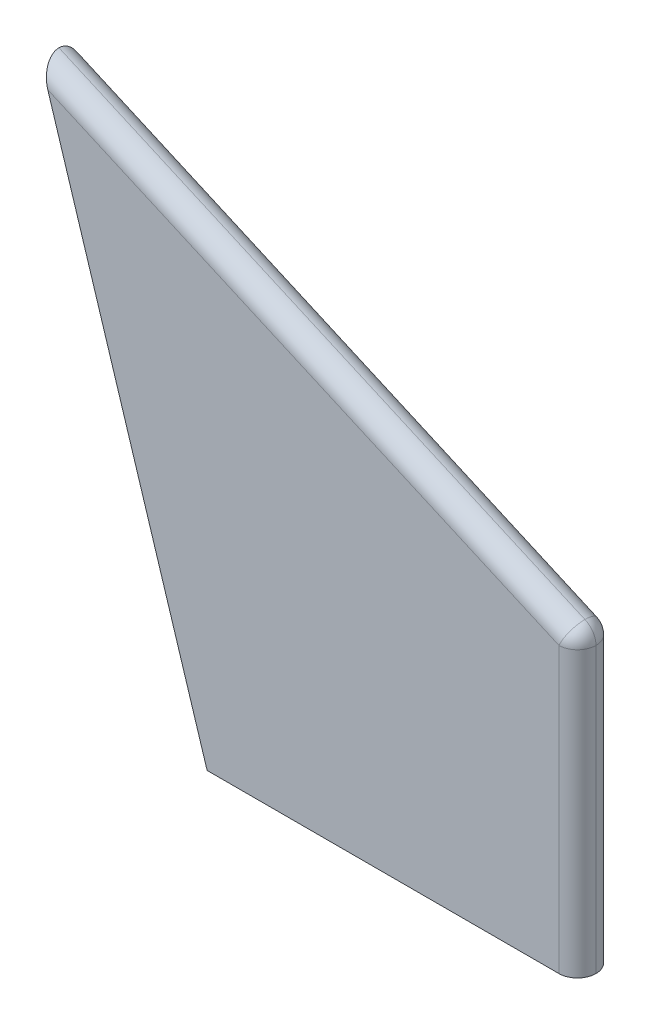
ISO-10303-21;
HEADER;
FILE_DESCRIPTION(('STEP AP214'),'2;1');
FILE_NAME('part.step','',(''),(''),'','','');
FILE_SCHEMA(('AUTOMOTIVE_DESIGN { 1 0 10303 214 1 1 1 1 }'));
ENDSEC;
DATA;
#1=APPLICATION_CONTEXT('core data for automotive mechanical design processes');
#2=APPLICATION_PROTOCOL_DEFINITION('international standard','automotive_design',2000,#1);
#3=PRODUCT_CONTEXT('',#1,'mechanical');
#4=PRODUCT('Part','Part','',(#3));
#5=PRODUCT_RELATED_PRODUCT_CATEGORY('part','',(#4));
#6=PRODUCT_DEFINITION_FORMATION('','',#4);
#7=PRODUCT_DEFINITION_CONTEXT('part definition',#1,'design');
#8=PRODUCT_DEFINITION('design','',#6,#7);
#9=PRODUCT_DEFINITION_SHAPE('','',#8);
#10=(LENGTH_UNIT() NAMED_UNIT(*) SI_UNIT(.MILLI.,.METRE.));
#11=(NAMED_UNIT(*) PLANE_ANGLE_UNIT() SI_UNIT($,.RADIAN.));
#12=(NAMED_UNIT(*) SI_UNIT($,.STERADIAN.) SOLID_ANGLE_UNIT());
#13=UNCERTAINTY_MEASURE_WITH_UNIT(LENGTH_MEASURE(1.E-05),#10,'distance_accuracy_value','');
#14=(GEOMETRIC_REPRESENTATION_CONTEXT(3) GLOBAL_UNCERTAINTY_ASSIGNED_CONTEXT((#13)) GLOBAL_UNIT_ASSIGNED_CONTEXT((#10,
#11,#12)) REPRESENTATION_CONTEXT('',''));
#15=CARTESIAN_POINT('',(0.,0.,0.));
#16=DIRECTION('',(0.,0.,1.));
#17=DIRECTION('',(1.,0.,0.));
#18=AXIS2_PLACEMENT_3D('',#15,#16,#17);
#19=CARTESIAN_POINT('',(178.472752746767,128.720260720498,2.5));
#20=DIRECTION('',(0.95447997803503,0.298274993135947,0.));
#21=DIRECTION('',(-0.298274993135947,0.95447997803503,0.));
#22=AXIS2_PLACEMENT_3D('',#19,#20,#21);
#23=PLANE('',#22);
#24=DIRECTION('',(0.,0.,-1.));
#25=VECTOR('',#24,1.);
#26=CARTESIAN_POINT('',(189.722752746767,92.7202607204978,2.5));
#27=LINE('',#26,#25);
#28=CARTESIAN_POINT('',(189.722752746767,92.7202607204978,0.0201626123751868));
#29=VERTEX_POINT('',#28);
#30=CARTESIAN_POINT('',(189.722752746767,92.7202607204978,0.));
#31=VERTEX_POINT('',#30);
#32=EDGE_CURVE('E222',#29,#31,#27,.T.);
#33=ORIENTED_EDGE('',*,*,#32,.F.);
#34=CARTESIAN_POINT('',(186.822752746767,102.000260720498,1.25));
#35=DIRECTION('',(0.95447997803503,0.298274993135947,0.));
#36=DIRECTION('',(0.298274993135947,-0.95447997803503,0.));
#37=AXIS2_PLACEMENT_3D('',#34,#35,#36);
#38=ELLIPSE('',#37,10.5607244069713,3.14999999999998);
#39=CARTESIAN_POINT('',(189.714119205727,92.7478880518253,0.));
#40=VERTEX_POINT('',#39);
#41=EDGE_CURVE('E231',#29,#40,#38,.T.);
#42=ORIENTED_EDGE('',*,*,#41,.T.);
#43=DIRECTION('',(0.298274993135947,-0.95447997803503,0.));
#44=VECTOR('',#43,1.);
#45=CARTESIAN_POINT('',(178.472752746767,128.720260720498,0.));
#46=LINE('',#45,#44);
#47=EDGE_CURVE('E176',#40,#31,#46,.T.);
#48=ORIENTED_EDGE('',*,*,#47,.T.);
#49=EDGE_LOOP('',(#33,#42,#48));
#50=FACE_BOUND('',#49,.T.);
#51=ADVANCED_FACE('F47',(#50),#23,.F.);
#52=DIRECTION('',(0.,0.,-1.));
#53=VECTOR('',#52,1.);
#54=CARTESIAN_POINT('',(189.691502746767,92.8202607204978,2.5));
#55=LINE('',#54,#53);
#56=CARTESIAN_POINT('',(189.691502746767,92.8202607204978,2.5));
#57=VERTEX_POINT('',#56);
#58=CARTESIAN_POINT('',(189.691502746767,92.8202607204978,0.));
#59=VERTEX_POINT('',#58);
#60=EDGE_CURVE('E63',#57,#59,#55,.T.);
#61=ORIENTED_EDGE('',*,*,#60,.F.);
#62=DIRECTION('',(0.298274993135947,-0.95447997803503,0.));
#63=VECTOR('',#62,1.);
#64=CARTESIAN_POINT('',(178.472752746767,128.720260720498,2.5));
#65=LINE('',#64,#63);
#66=CARTESIAN_POINT('',(178.968052924059,127.135300153165,2.5));
#67=VERTEX_POINT('',#66);
#68=EDGE_CURVE('E225',#67,#57,#65,.T.);
#69=ORIENTED_EDGE('',*,*,#68,.F.);
#70=CARTESIAN_POINT('',(178.968052924059,127.135300153165,1.25));
#71=DIRECTION('',(0.95447997803503,0.298274993135947,0.));
#72=DIRECTION('',(0.298274993135947,-0.95447997803503,0.));
#73=AXIS2_PLACEMENT_3D('',#70,#71,#72);
#74=ELLIPSE('',#73,1.66054878447608,1.25);
#75=CARTESIAN_POINT('',(178.472752746767,128.720260720498,1.25));
#76=VERTEX_POINT('',#75);
#77=EDGE_CURVE('E202',#67,#76,#74,.F.);
#78=ORIENTED_EDGE('',*,*,#77,.T.);
#79=CARTESIAN_POINT('',(178.968052924059,127.135300153165,1.25));
#80=DIRECTION('',(0.95447997803503,0.298274993135947,0.));
#81=DIRECTION('',(-0.298274993135947,0.95447997803503,0.));
#82=AXIS2_PLACEMENT_3D('',#79,#80,#81);
#83=ELLIPSE('',#82,1.66054878447608,1.25);
#84=CARTESIAN_POINT('',(178.968052924059,127.135300153165,0.));
#85=VERTEX_POINT('',#84);
#86=EDGE_CURVE('E214',#76,#85,#83,.F.);
#87=ORIENTED_EDGE('',*,*,#86,.T.);
#88=EDGE_CURVE('E144',#85,#59,#46,.T.);
#89=ORIENTED_EDGE('',*,*,#88,.T.);
#90=EDGE_LOOP('',(#61,#69,#78,#87,#89));
#91=FACE_BOUND('',#90,.T.);
#92=ADVANCED_FACE('F255',(#91),#23,.F.);
#93=CARTESIAN_POINT('',(189.714119205727,92.7478880518253,2.5));
#94=VERTEX_POINT('',#93);
#95=CARTESIAN_POINT('',(189.722752746767,92.7202607204978,2.5));
#96=VERTEX_POINT('',#95);
#97=EDGE_CURVE('E141',#94,#96,#65,.T.);
#98=ORIENTED_EDGE('',*,*,#97,.F.);
#99=CARTESIAN_POINT('',(189.722752746767,92.7202607204978,2.47983738762481));
#100=VERTEX_POINT('',#99);
#101=EDGE_CURVE('E98',#94,#100,#38,.T.);
#102=ORIENTED_EDGE('',*,*,#101,.T.);
#103=EDGE_CURVE('E203',#96,#100,#27,.T.);
#104=ORIENTED_EDGE('',*,*,#103,.F.);
#105=EDGE_LOOP('',(#98,#102,#104));
#106=FACE_BOUND('',#105,.T.);
#107=ADVANCED_FACE('F257',(#106),#23,.F.);
#108=CARTESIAN_POINT('',(189.722752746767,92.7202607204978,2.5));
#109=DIRECTION('',(0.,1.,0.));
#110=DIRECTION('',(-1.,0.,0.));
#111=AXIS2_PLACEMENT_3D('',#108,#109,#110);
#112=PLANE('',#111);
#113=ORIENTED_EDGE('',*,*,#103,.T.);
#114=CARTESIAN_POINT('',(186.822752746767,92.7202607204978,1.25));
#115=DIRECTION('',(0.,-1.,0.));
#116=DIRECTION('',(1.,0.,0.));
#117=AXIS2_PLACEMENT_3D('',#114,#115,#116);
#118=CIRCLE('',#117,3.14999999999998);
#119=EDGE_CURVE('E242',#29,#100,#118,.T.);
#120=ORIENTED_EDGE('',*,*,#119,.F.);
#121=ORIENTED_EDGE('',*,*,#32,.T.);
#122=DIRECTION('',(1.,0.,0.));
#123=VECTOR('',#122,1.);
#124=CARTESIAN_POINT('',(189.722752746767,92.7202607204978,0.));
#125=LINE('',#124,#123);
#126=CARTESIAN_POINT('',(213.472752746767,92.7202607204978,0.));
#127=VERTEX_POINT('',#126);
#128=EDGE_CURVE('E170',#31,#127,#125,.T.);
#129=ORIENTED_EDGE('',*,*,#128,.T.);
#130=CARTESIAN_POINT('',(213.472752746767,92.7202607204978,1.25));
#131=DIRECTION('',(0.,1.,0.));
#132=DIRECTION('',(-1.,0.,0.));
#133=AXIS2_PLACEMENT_3D('',#130,#131,#132);
#134=CIRCLE('',#133,1.25);
#135=CARTESIAN_POINT('',(214.722752746767,92.7202607204978,1.25));
#136=VERTEX_POINT('',#135);
#137=EDGE_CURVE('E132',#127,#136,#134,.F.);
#138=ORIENTED_EDGE('',*,*,#137,.T.);
#139=CARTESIAN_POINT('',(213.472752746767,92.7202607204978,1.25));
#140=DIRECTION('',(0.,1.,0.));
#141=DIRECTION('',(-1.,0.,0.));
#142=AXIS2_PLACEMENT_3D('',#139,#140,#141);
#143=CIRCLE('',#142,1.25);
#144=CARTESIAN_POINT('',(213.472752746767,92.7202607204978,2.5));
#145=VERTEX_POINT('',#144);
#146=EDGE_CURVE('E127',#136,#145,#143,.F.);
#147=ORIENTED_EDGE('',*,*,#146,.T.);
#148=DIRECTION('',(1.,0.,0.));
#149=VECTOR('',#148,1.);
#150=CARTESIAN_POINT('',(189.722752746767,92.7202607204978,2.5));
#151=LINE('',#150,#149);
#152=EDGE_CURVE('E130',#96,#145,#151,.T.);
#153=ORIENTED_EDGE('',*,*,#152,.F.);
#154=EDGE_LOOP('',(#113,#120,#121,#129,#138,#147,#153));
#155=FACE_BOUND('',#154,.T.);
#156=ADVANCED_FACE('F129',(#155),#112,.F.);
#157=CARTESIAN_POINT('',(0.,0.,2.5));
#158=DIRECTION('',(0.,0.,1.));
#159=DIRECTION('',(1.,0.,0.));
#160=AXIS2_PLACEMENT_3D('',#157,#158,#159);
#161=PLANE('',#160);
#162=DIRECTION('',(0.,-1.,0.));
#163=VECTOR('',#162,1.);
#164=CARTESIAN_POINT('',(189.714119205727,92.8202607204978,2.5));
#165=LINE('',#164,#163);
#166=CARTESIAN_POINT('',(189.714119205727,92.8202607204978,2.5));
#167=VERTEX_POINT('',#166);
#168=EDGE_CURVE('E228',#94,#167,#165,.F.);
#169=ORIENTED_EDGE('',*,*,#168,.F.);
#170=ORIENTED_EDGE('',*,*,#97,.T.);
#171=ORIENTED_EDGE('',*,*,#152,.T.);
#172=DIRECTION('',(0.,1.,0.));
#173=VECTOR('',#172,1.);
#174=CARTESIAN_POINT('',(213.472752746767,111.353915403832,2.5));
#175=LINE('',#174,#173);
#176=CARTESIAN_POINT('',(213.472752746767,111.905639541763,2.5));
#177=VERTEX_POINT('',#176);
#178=EDGE_CURVE('E72',#145,#177,#175,.T.);
#179=ORIENTED_EDGE('',*,*,#178,.T.);
#180=DIRECTION('',(0.914849258641217,-0.403795534848537,0.));
#181=VECTOR('',#180,1.);
#182=CARTESIAN_POINT('',(76.1462015922261,172.518737982388,2.5));
#183=LINE('',#182,#181);
#184=EDGE_CURVE('E180',#177,#67,#183,.F.);
#185=ORIENTED_EDGE('',*,*,#184,.T.);
#186=ORIENTED_EDGE('',*,*,#68,.T.);
#187=DIRECTION('',(1.,0.,0.));
#188=VECTOR('',#187,1.);
#189=CARTESIAN_POINT('',(0.,92.8202607204979,2.5));
#190=LINE('',#189,#188);
#191=EDGE_CURVE('E235',#57,#167,#190,.T.);
#192=ORIENTED_EDGE('',*,*,#191,.T.);
#193=EDGE_LOOP('',(#169,#170,#171,#179,#185,#186,#192));
#194=FACE_BOUND('',#193,.T.);
#195=ADVANCED_FACE('F139',(#194),#161,.T.);
#196=CARTESIAN_POINT('',(0.,0.,0.));
#197=DIRECTION('',(0.,0.,1.));
#198=DIRECTION('',(1.,0.,0.));
#199=AXIS2_PLACEMENT_3D('',#196,#197,#198);
#200=PLANE('',#199);
#201=ORIENTED_EDGE('',*,*,#47,.F.);
#202=DIRECTION('',(0.,-1.,0.));
#203=VECTOR('',#202,1.);
#204=CARTESIAN_POINT('',(189.714119205727,92.8202607204978,0.));
#205=LINE('',#204,#203);
#206=CARTESIAN_POINT('',(189.714119205727,92.8202607204978,0.));
#207=VERTEX_POINT('',#206);
#208=EDGE_CURVE('E11',#40,#207,#205,.F.);
#209=ORIENTED_EDGE('',*,*,#208,.T.);
#210=DIRECTION('',(1.,0.,0.));
#211=VECTOR('',#210,1.);
#212=CARTESIAN_POINT('',(0.,92.8202607204979,0.));
#213=LINE('',#212,#211);
#214=EDGE_CURVE('E56',#59,#207,#213,.T.);
#215=ORIENTED_EDGE('',*,*,#214,.F.);
#216=ORIENTED_EDGE('',*,*,#88,.F.);
#217=DIRECTION('',(0.914849258641217,-0.403795534848537,0.));
#218=VECTOR('',#217,1.);
#219=CARTESIAN_POINT('',(214.218008328207,111.576699147196,0.));
#220=LINE('',#219,#218);
#221=CARTESIAN_POINT('',(213.472752746767,111.905639541763,0.));
#222=VERTEX_POINT('',#221);
#223=EDGE_CURVE('E191',#85,#222,#220,.T.);
#224=ORIENTED_EDGE('',*,*,#223,.T.);
#225=DIRECTION('',(0.,1.,0.));
#226=VECTOR('',#225,1.);
#227=CARTESIAN_POINT('',(213.472752746767,0.,0.));
#228=LINE('',#227,#226);
#229=EDGE_CURVE('E137',#222,#127,#228,.F.);
#230=ORIENTED_EDGE('',*,*,#229,.T.);
#231=ORIENTED_EDGE('',*,*,#128,.F.);
#232=EDGE_LOOP('',(#201,#209,#215,#216,#224,#230,#231));
#233=FACE_BOUND('',#232,.T.);
#234=ADVANCED_FACE('F198',(#233),#200,.F.);
#235=CARTESIAN_POINT('',(177.968008328207,127.576699147196,1.25));
#236=DIRECTION('',(0.914849258641217,-0.403795534848537,0.));
#237=DIRECTION('',(0.403795534848537,0.914849258641217,0.));
#238=AXIS2_PLACEMENT_3D('',#235,#236,#237);
#239=CYLINDRICAL_SURFACE('',#238,1.25);
#240=ORIENTED_EDGE('',*,*,#184,.F.);
#241=CARTESIAN_POINT('',(213.472752746767,111.905639541763,1.25));
#242=DIRECTION('',(0.914849258641217,-0.403795534848537,0.));
#243=DIRECTION('',(0.403795534848537,0.914849258641217,0.));
#244=AXIS2_PLACEMENT_3D('',#241,#242,#243);
#245=CIRCLE('',#244,1.25);
#246=CARTESIAN_POINT('',(213.977497165328,113.049201115064,1.25));
#247=VERTEX_POINT('',#246);
#248=EDGE_CURVE('E148',#177,#247,#245,.F.);
#249=ORIENTED_EDGE('',*,*,#248,.T.);
#250=DIRECTION('',(0.914849258641217,-0.403795534848537,0.));
#251=VECTOR('',#250,1.);
#252=CARTESIAN_POINT('',(178.472752746767,128.720260720498,1.25));
#253=LINE('',#252,#251);
#254=EDGE_CURVE('E167',#76,#247,#253,.T.);
#255=ORIENTED_EDGE('',*,*,#254,.F.);
#256=ORIENTED_EDGE('',*,*,#77,.F.);
#257=EDGE_LOOP('',(#240,#249,#255,#256));
#258=FACE_BOUND('',#257,.T.);
#259=ADVANCED_FACE('F209',(#258),#239,.T.);
#260=CARTESIAN_POINT('',(76.1462015922261,172.518737982388,1.25));
#261=DIRECTION('',(-0.914849258641217,0.403795534848537,0.));
#262=DIRECTION('',(-0.403795534848537,-0.914849258641217,0.));
#263=AXIS2_PLACEMENT_3D('',#260,#261,#262);
#264=CYLINDRICAL_SURFACE('',#263,1.25);
#265=ORIENTED_EDGE('',*,*,#254,.T.);
#266=CARTESIAN_POINT('',(213.472752746767,111.905639541763,1.25));
#267=DIRECTION('',(-0.914849258641217,0.403795534848537,0.));
#268=DIRECTION('',(-0.403795534848537,-0.914849258641217,0.));
#269=AXIS2_PLACEMENT_3D('',#266,#267,#268);
#270=CIRCLE('',#269,1.25);
#271=EDGE_CURVE('E152',#247,#222,#270,.T.);
#272=ORIENTED_EDGE('',*,*,#271,.T.);
#273=ORIENTED_EDGE('',*,*,#223,.F.);
#274=ORIENTED_EDGE('',*,*,#86,.F.);
#275=EDGE_LOOP('',(#265,#272,#273,#274));
#276=FACE_BOUND('',#275,.T.);
#277=ADVANCED_FACE('F190',(#276),#264,.T.);
#278=CARTESIAN_POINT('',(213.472752746767,111.905639541763,1.25));
#279=DIRECTION('',(-1.,0.,0.));
#280=DIRECTION('',(0.,0.,1.));
#281=AXIS2_PLACEMENT_3D('',#278,#279,#280);
#282=SPHERICAL_SURFACE('',#281,1.25);
#283=CARTESIAN_POINT('',(213.472752746767,111.905639541763,1.25));
#284=DIRECTION('',(0.,0.,-1.));
#285=DIRECTION('',(-1.,0.,0.));
#286=AXIS2_PLACEMENT_3D('',#283,#284,#285);
#287=CIRCLE('',#286,1.25);
#288=CARTESIAN_POINT('',(214.722752746767,111.905639541763,1.25));
#289=VERTEX_POINT('',#288);
#290=EDGE_CURVE('E163',#247,#289,#287,.T.);
#291=ORIENTED_EDGE('',*,*,#290,.F.);
#292=ORIENTED_EDGE('',*,*,#248,.F.);
#293=CARTESIAN_POINT('',(213.472752746767,111.905639541763,1.25));
#294=DIRECTION('',(0.,-1.,0.));
#295=DIRECTION('',(0.,0.,-1.));
#296=AXIS2_PLACEMENT_3D('',#293,#294,#295);
#297=CIRCLE('',#296,1.25);
#298=EDGE_CURVE('E86',#289,#177,#297,.T.);
#299=ORIENTED_EDGE('',*,*,#298,.F.);
#300=EDGE_LOOP('',(#291,#292,#299));
#301=FACE_BOUND('',#300,.T.);
#302=ADVANCED_FACE('F49',(#301),#282,.T.);
#303=CARTESIAN_POINT('',(213.472752746767,0.,1.25));
#304=DIRECTION('',(0.,-1.,0.));
#305=DIRECTION('',(0.,0.,-1.));
#306=AXIS2_PLACEMENT_3D('',#303,#304,#305);
#307=CYLINDRICAL_SURFACE('',#306,1.25);
#308=ORIENTED_EDGE('',*,*,#178,.F.);
#309=ORIENTED_EDGE('',*,*,#146,.F.);
#310=DIRECTION('',(0.,1.,0.));
#311=VECTOR('',#310,1.);
#312=CARTESIAN_POINT('',(214.722752746767,92.7202607204978,1.25));
#313=LINE('',#312,#311);
#314=EDGE_CURVE('E160',#289,#136,#313,.F.);
#315=ORIENTED_EDGE('',*,*,#314,.F.);
#316=ORIENTED_EDGE('',*,*,#298,.T.);
#317=EDGE_LOOP('',(#308,#309,#315,#316));
#318=FACE_BOUND('',#317,.T.);
#319=ADVANCED_FACE('F146',(#318),#307,.T.);
#320=CARTESIAN_POINT('',(213.472752746767,111.905639541763,1.25));
#321=DIRECTION('',(-1.,0.,0.));
#322=DIRECTION('',(0.,0.,1.));
#323=AXIS2_PLACEMENT_3D('',#320,#321,#322);
#324=SPHERICAL_SURFACE('',#323,1.25);
#325=ORIENTED_EDGE('',*,*,#271,.F.);
#326=ORIENTED_EDGE('',*,*,#290,.T.);
#327=CARTESIAN_POINT('',(213.472752746767,111.905639541763,1.25));
#328=DIRECTION('',(0.,-1.,0.));
#329=DIRECTION('',(0.,0.,-1.));
#330=AXIS2_PLACEMENT_3D('',#327,#328,#329);
#331=CIRCLE('',#330,1.25);
#332=EDGE_CURVE('E156',#222,#289,#331,.T.);
#333=ORIENTED_EDGE('',*,*,#332,.F.);
#334=EDGE_LOOP('',(#325,#326,#333));
#335=FACE_BOUND('',#334,.T.);
#336=ADVANCED_FACE('F207',(#335),#324,.T.);
#337=CARTESIAN_POINT('',(213.472752746767,92.7202607204978,1.25));
#338=DIRECTION('',(0.,1.,0.));
#339=DIRECTION('',(0.,0.,1.));
#340=AXIS2_PLACEMENT_3D('',#337,#338,#339);
#341=CYLINDRICAL_SURFACE('',#340,1.25);
#342=ORIENTED_EDGE('',*,*,#137,.F.);
#343=ORIENTED_EDGE('',*,*,#229,.F.);
#344=ORIENTED_EDGE('',*,*,#332,.T.);
#345=ORIENTED_EDGE('',*,*,#314,.T.);
#346=EDGE_LOOP('',(#342,#343,#344,#345));
#347=FACE_BOUND('',#346,.T.);
#348=ADVANCED_FACE('F206',(#347),#341,.T.);
#349=CARTESIAN_POINT('',(186.822752746767,92.8202607204978,1.25));
#350=DIRECTION('',(0.,-1.,0.));
#351=DIRECTION('',(1.,0.,0.));
#352=AXIS2_PLACEMENT_3D('',#349,#350,#351);
#353=CYLINDRICAL_SURFACE('',#352,3.14999999999998);
#354=ORIENTED_EDGE('',*,*,#168,.T.);
#355=CARTESIAN_POINT('',(186.822752746767,92.8202607204978,1.25));
#356=DIRECTION('',(0.,-1.,0.));
#357=DIRECTION('',(1.,0.,0.));
#358=AXIS2_PLACEMENT_3D('',#355,#356,#357);
#359=CIRCLE('',#358,3.14999999999998);
#360=EDGE_CURVE('E241',#207,#167,#359,.T.);
#361=ORIENTED_EDGE('',*,*,#360,.F.);
#362=ORIENTED_EDGE('',*,*,#208,.F.);
#363=ORIENTED_EDGE('',*,*,#41,.F.);
#364=ORIENTED_EDGE('',*,*,#119,.T.);
#365=ORIENTED_EDGE('',*,*,#101,.F.);
#366=EDGE_LOOP('',(#354,#361,#362,#363,#364,#365));
#367=FACE_BOUND('',#366,.T.);
#368=ADVANCED_FACE('F276',(#367),#353,.F.);
#369=CARTESIAN_POINT('',(0.,92.8202607204979,0.));
#370=DIRECTION('',(0.,-1.,0.));
#371=DIRECTION('',(1.,0.,0.));
#372=AXIS2_PLACEMENT_3D('',#369,#370,#371);
#373=PLANE('',#372);
#374=ORIENTED_EDGE('',*,*,#60,.T.);
#375=ORIENTED_EDGE('',*,*,#214,.T.);
#376=ORIENTED_EDGE('',*,*,#360,.T.);
#377=ORIENTED_EDGE('',*,*,#191,.F.);
#378=EDGE_LOOP('',(#374,#375,#376,#377));
#379=FACE_BOUND('',#378,.T.);
#380=ADVANCED_FACE('F249',(#379),#373,.T.);
#381=CLOSED_SHELL('',(#51,#92,#107,#156,#195,#234,#259,#277,#302,#319,#336,#348,#368,#380));
#382=MANIFOLD_SOLID_BREP('B2',#381);
#383=ADVANCED_BREP_SHAPE_REPRESENTATION('',(#18,#382),#14);
#384=SHAPE_DEFINITION_REPRESENTATION(#9,#383);
ENDSEC;
END-ISO-10303-21;
